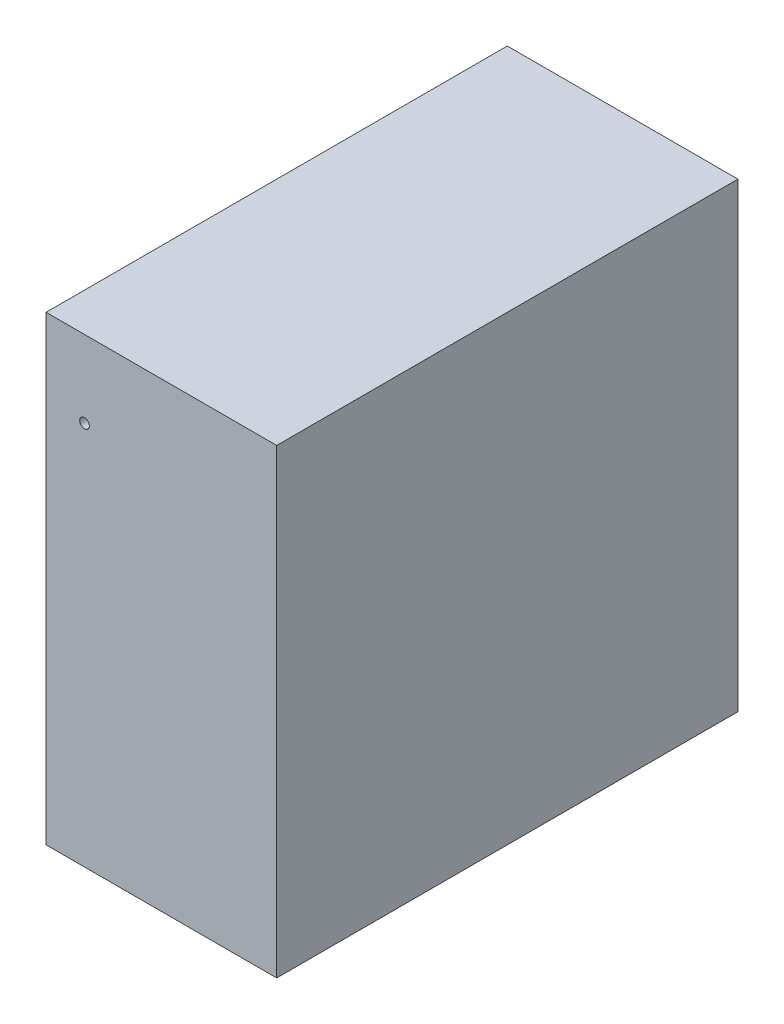
ISO-10303-21;
HEADER;
FILE_DESCRIPTION(('STEP AP214'),'2;1');
FILE_NAME('part.step','',(''),(''),'','','');
FILE_SCHEMA(('AUTOMOTIVE_DESIGN { 1 0 10303 214 1 1 1 1 }'));
ENDSEC;
DATA;
#1=APPLICATION_CONTEXT('core data for automotive mechanical design processes');
#2=APPLICATION_PROTOCOL_DEFINITION('international standard','automotive_design',2000,#1);
#3=PRODUCT_CONTEXT('',#1,'mechanical');
#4=PRODUCT('Part','Part','',(#3));
#5=PRODUCT_RELATED_PRODUCT_CATEGORY('part','',(#4));
#6=PRODUCT_DEFINITION_FORMATION('','',#4);
#7=PRODUCT_DEFINITION_CONTEXT('part definition',#1,'design');
#8=PRODUCT_DEFINITION('design','',#6,#7);
#9=PRODUCT_DEFINITION_SHAPE('','',#8);
#10=(LENGTH_UNIT() NAMED_UNIT(*) SI_UNIT(.MILLI.,.METRE.));
#11=(NAMED_UNIT(*) PLANE_ANGLE_UNIT() SI_UNIT($,.RADIAN.));
#12=(NAMED_UNIT(*) SI_UNIT($,.STERADIAN.) SOLID_ANGLE_UNIT());
#13=UNCERTAINTY_MEASURE_WITH_UNIT(LENGTH_MEASURE(1.E-05),#10,'distance_accuracy_value','');
#14=(GEOMETRIC_REPRESENTATION_CONTEXT(3) GLOBAL_UNCERTAINTY_ASSIGNED_CONTEXT((#13)) GLOBAL_UNIT_ASSIGNED_CONTEXT((#10,
#11,#12)) REPRESENTATION_CONTEXT('',''));
#15=CARTESIAN_POINT('',(0.,0.,0.));
#16=DIRECTION('',(0.,0.,1.));
#17=DIRECTION('',(1.,0.,0.));
#18=AXIS2_PLACEMENT_3D('',#15,#16,#17);
#19=CARTESIAN_POINT('',(0.,0.,304.8));
#20=DIRECTION('',(0.,0.,1.));
#21=DIRECTION('',(1.,0.,0.));
#22=AXIS2_PLACEMENT_3D('',#19,#20,#21);
#23=PLANE('',#22);
#24=DIRECTION('',(0.,1.,0.));
#25=VECTOR('',#24,1.);
#26=CARTESIAN_POINT('',(76.2,152.4,304.8));
#27=LINE('',#26,#25);
#28=CARTESIAN_POINT('',(76.2,-152.4,304.8));
#29=VERTEX_POINT('',#28);
#30=CARTESIAN_POINT('',(76.2,152.4,304.8));
#31=VERTEX_POINT('',#30);
#32=EDGE_CURVE('E85',#29,#31,#27,.T.);
#33=ORIENTED_EDGE('',*,*,#32,.T.);
#34=DIRECTION('',(-1.,0.,0.));
#35=VECTOR('',#34,1.);
#36=CARTESIAN_POINT('',(-76.2,152.4,304.8));
#37=LINE('',#36,#35);
#38=CARTESIAN_POINT('',(-76.2,152.4,304.8));
#39=VERTEX_POINT('',#38);
#40=EDGE_CURVE('E80',#31,#39,#37,.T.);
#41=ORIENTED_EDGE('',*,*,#40,.T.);
#42=DIRECTION('',(0.,-1.,0.));
#43=VECTOR('',#42,1.);
#44=CARTESIAN_POINT('',(-76.2,152.4,304.8));
#45=LINE('',#44,#43);
#46=CARTESIAN_POINT('',(-76.2,-152.4,304.8));
#47=VERTEX_POINT('',#46);
#48=EDGE_CURVE('E83',#39,#47,#45,.T.);
#49=ORIENTED_EDGE('',*,*,#48,.T.);
#50=DIRECTION('',(1.,0.,0.));
#51=VECTOR('',#50,1.);
#52=CARTESIAN_POINT('',(-76.2,-152.4,304.8));
#53=LINE('',#52,#51);
#54=EDGE_CURVE('E50',#47,#29,#53,.T.);
#55=ORIENTED_EDGE('',*,*,#54,.T.);
#56=EDGE_LOOP('',(#33,#41,#49,#55));
#57=FACE_BOUND('',#56,.T.);
#58=CARTESIAN_POINT('',(-50.8,101.6,304.8));
#59=DIRECTION('',(0.,0.,1.));
#60=DIRECTION('',(1.,0.,0.));
#61=AXIS2_PLACEMENT_3D('',#58,#59,#60);
#62=CIRCLE('',#61,3.175);
#63=CARTESIAN_POINT('',(-53.975,101.6,304.8));
#64=VERTEX_POINT('',#63);
#65=EDGE_CURVE('E100',#64,#64,#62,.T.);
#66=ORIENTED_EDGE('',*,*,#65,.F.);
#67=EDGE_LOOP('',(#66));
#68=FACE_BOUND('',#67,.T.);
#69=ADVANCED_FACE('F33',(#57,#68),#23,.T.);
#70=CARTESIAN_POINT('',(0.,0.,0.));
#71=DIRECTION('',(0.,0.,1.));
#72=DIRECTION('',(1.,0.,0.));
#73=AXIS2_PLACEMENT_3D('',#70,#71,#72);
#74=PLANE('',#73);
#75=DIRECTION('',(0.,1.,0.));
#76=VECTOR('',#75,1.);
#77=CARTESIAN_POINT('',(76.2,152.4,0.));
#78=LINE('',#77,#76);
#79=CARTESIAN_POINT('',(76.2,-152.4,0.));
#80=VERTEX_POINT('',#79);
#81=CARTESIAN_POINT('',(76.2,152.4,0.));
#82=VERTEX_POINT('',#81);
#83=EDGE_CURVE('E97',#80,#82,#78,.T.);
#84=ORIENTED_EDGE('',*,*,#83,.F.);
#85=DIRECTION('',(1.,0.,0.));
#86=VECTOR('',#85,1.);
#87=CARTESIAN_POINT('',(-76.2,-152.4,0.));
#88=LINE('',#87,#86);
#89=CARTESIAN_POINT('',(-76.2,-152.4,0.));
#90=VERTEX_POINT('',#89);
#91=EDGE_CURVE('E73',#90,#80,#88,.T.);
#92=ORIENTED_EDGE('',*,*,#91,.F.);
#93=DIRECTION('',(0.,-1.,0.));
#94=VECTOR('',#93,1.);
#95=CARTESIAN_POINT('',(-76.2,152.4,0.));
#96=LINE('',#95,#94);
#97=CARTESIAN_POINT('',(-76.2,152.4,0.));
#98=VERTEX_POINT('',#97);
#99=EDGE_CURVE('E67',#98,#90,#96,.T.);
#100=ORIENTED_EDGE('',*,*,#99,.F.);
#101=DIRECTION('',(-1.,0.,0.));
#102=VECTOR('',#101,1.);
#103=CARTESIAN_POINT('',(-76.2,152.4,0.));
#104=LINE('',#103,#102);
#105=EDGE_CURVE('E89',#82,#98,#104,.T.);
#106=ORIENTED_EDGE('',*,*,#105,.F.);
#107=EDGE_LOOP('',(#84,#92,#100,#106));
#108=FACE_BOUND('',#107,.T.);
#109=CARTESIAN_POINT('',(-50.8,101.6,0.));
#110=DIRECTION('',(0.,0.,1.));
#111=DIRECTION('',(1.,0.,0.));
#112=AXIS2_PLACEMENT_3D('',#109,#110,#111);
#113=CIRCLE('',#112,3.175);
#114=CARTESIAN_POINT('',(-53.975,101.6,0.));
#115=VERTEX_POINT('',#114);
#116=EDGE_CURVE('E112',#115,#115,#113,.T.);
#117=ORIENTED_EDGE('',*,*,#116,.T.);
#118=EDGE_LOOP('',(#117));
#119=FACE_BOUND('',#118,.T.);
#120=ADVANCED_FACE('F108',(#108,#119),#74,.F.);
#121=CARTESIAN_POINT('',(76.2,152.4,304.8));
#122=DIRECTION('',(-1.,0.,0.));
#123=DIRECTION('',(0.,-1.,0.));
#124=AXIS2_PLACEMENT_3D('',#121,#122,#123);
#125=PLANE('',#124);
#126=ORIENTED_EDGE('',*,*,#83,.T.);
#127=DIRECTION('',(0.,0.,-1.));
#128=VECTOR('',#127,1.);
#129=CARTESIAN_POINT('',(76.2,152.4,304.8));
#130=LINE('',#129,#128);
#131=EDGE_CURVE('E11',#31,#82,#130,.T.);
#132=ORIENTED_EDGE('',*,*,#131,.F.);
#133=ORIENTED_EDGE('',*,*,#32,.F.);
#134=DIRECTION('',(0.,0.,-1.));
#135=VECTOR('',#134,1.);
#136=CARTESIAN_POINT('',(76.2,-152.4,304.8));
#137=LINE('',#136,#135);
#138=EDGE_CURVE('E93',#29,#80,#137,.T.);
#139=ORIENTED_EDGE('',*,*,#138,.T.);
#140=EDGE_LOOP('',(#126,#132,#133,#139));
#141=FACE_BOUND('',#140,.T.);
#142=ADVANCED_FACE('F35',(#141),#125,.F.);
#143=CARTESIAN_POINT('',(-76.2,152.4,304.8));
#144=DIRECTION('',(0.,-1.,0.));
#145=DIRECTION('',(0.,0.,-1.));
#146=AXIS2_PLACEMENT_3D('',#143,#144,#145);
#147=PLANE('',#146);
#148=ORIENTED_EDGE('',*,*,#105,.T.);
#149=DIRECTION('',(0.,0.,-1.));
#150=VECTOR('',#149,1.);
#151=CARTESIAN_POINT('',(-76.2,152.4,304.8));
#152=LINE('',#151,#150);
#153=EDGE_CURVE('E42',#39,#98,#152,.T.);
#154=ORIENTED_EDGE('',*,*,#153,.F.);
#155=ORIENTED_EDGE('',*,*,#40,.F.);
#156=ORIENTED_EDGE('',*,*,#131,.T.);
#157=EDGE_LOOP('',(#148,#154,#155,#156));
#158=FACE_BOUND('',#157,.T.);
#159=ADVANCED_FACE('F88',(#158),#147,.F.);
#160=CARTESIAN_POINT('',(-76.2,152.4,304.8));
#161=DIRECTION('',(1.,0.,0.));
#162=DIRECTION('',(0.,1.,0.));
#163=AXIS2_PLACEMENT_3D('',#160,#161,#162);
#164=PLANE('',#163);
#165=ORIENTED_EDGE('',*,*,#99,.T.);
#166=DIRECTION('',(0.,0.,-1.));
#167=VECTOR('',#166,1.);
#168=CARTESIAN_POINT('',(-76.2,-152.4,304.8));
#169=LINE('',#168,#167);
#170=EDGE_CURVE('E90',#47,#90,#169,.T.);
#171=ORIENTED_EDGE('',*,*,#170,.F.);
#172=ORIENTED_EDGE('',*,*,#48,.F.);
#173=ORIENTED_EDGE('',*,*,#153,.T.);
#174=EDGE_LOOP('',(#165,#171,#172,#173));
#175=FACE_BOUND('',#174,.T.);
#176=ADVANCED_FACE('F91',(#175),#164,.F.);
#177=CARTESIAN_POINT('',(-76.2,-152.4,304.8));
#178=DIRECTION('',(0.,1.,0.));
#179=DIRECTION('',(0.,0.,1.));
#180=AXIS2_PLACEMENT_3D('',#177,#178,#179);
#181=PLANE('',#180);
#182=ORIENTED_EDGE('',*,*,#91,.T.);
#183=ORIENTED_EDGE('',*,*,#138,.F.);
#184=ORIENTED_EDGE('',*,*,#54,.F.);
#185=ORIENTED_EDGE('',*,*,#170,.T.);
#186=EDGE_LOOP('',(#182,#183,#184,#185));
#187=FACE_BOUND('',#186,.T.);
#188=ADVANCED_FACE('F105',(#187),#181,.F.);
#189=CARTESIAN_POINT('',(-50.8,101.6,304.8));
#190=DIRECTION('',(0.,0.,-1.));
#191=DIRECTION('',(-1.,0.,0.));
#192=AXIS2_PLACEMENT_3D('',#189,#190,#191);
#193=CYLINDRICAL_SURFACE('',#192,3.175);
#194=CARTESIAN_POINT('',(-53.975,101.6,304.8));
#195=CARTESIAN_POINT('',(-53.975,101.6,301.625));
#196=CARTESIAN_POINT('',(-53.975,101.6,298.45));
#197=CARTESIAN_POINT('',(-53.975,101.6,292.1));
#198=CARTESIAN_POINT('',(-53.975,101.6,288.925));
#199=CARTESIAN_POINT('',(-53.975,101.6,282.575));
#200=CARTESIAN_POINT('',(-53.975,101.6,279.4));
#201=CARTESIAN_POINT('',(-53.975,101.6,273.05));
#202=CARTESIAN_POINT('',(-53.975,101.6,269.875));
#203=CARTESIAN_POINT('',(-53.975,101.6,263.525));
#204=CARTESIAN_POINT('',(-53.975,101.6,260.35));
#205=CARTESIAN_POINT('',(-53.975,101.6,254.));
#206=CARTESIAN_POINT('',(-53.975,101.6,250.825));
#207=CARTESIAN_POINT('',(-53.975,101.6,244.475));
#208=CARTESIAN_POINT('',(-53.975,101.6,241.3));
#209=CARTESIAN_POINT('',(-53.975,101.6,234.95));
#210=CARTESIAN_POINT('',(-53.975,101.6,231.775));
#211=CARTESIAN_POINT('',(-53.975,101.6,225.425));
#212=CARTESIAN_POINT('',(-53.975,101.6,222.25));
#213=CARTESIAN_POINT('',(-53.975,101.6,215.9));
#214=CARTESIAN_POINT('',(-53.975,101.6,212.725));
#215=CARTESIAN_POINT('',(-53.975,101.6,206.375));
#216=CARTESIAN_POINT('',(-53.975,101.6,203.2));
#217=CARTESIAN_POINT('',(-53.975,101.6,196.85));
#218=CARTESIAN_POINT('',(-53.975,101.6,193.675));
#219=CARTESIAN_POINT('',(-53.975,101.6,187.325));
#220=CARTESIAN_POINT('',(-53.975,101.6,184.15));
#221=CARTESIAN_POINT('',(-53.975,101.6,177.8));
#222=CARTESIAN_POINT('',(-53.975,101.6,174.625));
#223=CARTESIAN_POINT('',(-53.975,101.6,168.275));
#224=CARTESIAN_POINT('',(-53.975,101.6,165.1));
#225=CARTESIAN_POINT('',(-53.975,101.6,158.75));
#226=CARTESIAN_POINT('',(-53.975,101.6,155.575));
#227=CARTESIAN_POINT('',(-53.975,101.6,149.225));
#228=CARTESIAN_POINT('',(-53.975,101.6,146.05));
#229=CARTESIAN_POINT('',(-53.975,101.6,139.7));
#230=CARTESIAN_POINT('',(-53.975,101.6,136.525));
#231=CARTESIAN_POINT('',(-53.975,101.6,130.175));
#232=CARTESIAN_POINT('',(-53.975,101.6,127.));
#233=CARTESIAN_POINT('',(-53.975,101.6,120.65));
#234=CARTESIAN_POINT('',(-53.975,101.6,117.475));
#235=CARTESIAN_POINT('',(-53.975,101.6,111.125));
#236=CARTESIAN_POINT('',(-53.975,101.6,107.95));
#237=CARTESIAN_POINT('',(-53.975,101.6,101.6));
#238=CARTESIAN_POINT('',(-53.975,101.6,98.425));
#239=CARTESIAN_POINT('',(-53.975,101.6,92.075));
#240=CARTESIAN_POINT('',(-53.975,101.6,88.9));
#241=CARTESIAN_POINT('',(-53.975,101.6,82.55));
#242=CARTESIAN_POINT('',(-53.975,101.6,79.375));
#243=CARTESIAN_POINT('',(-53.975,101.6,73.025));
#244=CARTESIAN_POINT('',(-53.975,101.6,69.85));
#245=CARTESIAN_POINT('',(-53.975,101.6,63.5));
#246=CARTESIAN_POINT('',(-53.975,101.6,60.325));
#247=CARTESIAN_POINT('',(-53.975,101.6,53.975));
#248=CARTESIAN_POINT('',(-53.975,101.6,50.8));
#249=CARTESIAN_POINT('',(-53.975,101.6,44.45));
#250=CARTESIAN_POINT('',(-53.975,101.6,41.275));
#251=CARTESIAN_POINT('',(-53.975,101.6,34.925));
#252=CARTESIAN_POINT('',(-53.975,101.6,31.75));
#253=CARTESIAN_POINT('',(-53.975,101.6,25.4));
#254=CARTESIAN_POINT('',(-53.975,101.6,22.225));
#255=CARTESIAN_POINT('',(-53.975,101.6,15.875));
#256=CARTESIAN_POINT('',(-53.975,101.6,12.7));
#257=CARTESIAN_POINT('',(-53.975,101.6,6.35));
#258=CARTESIAN_POINT('',(-53.975,101.6,3.175));
#259=CARTESIAN_POINT('',(-53.975,101.6,0.));
#260=B_SPLINE_CURVE_WITH_KNOTS('',3,(#194,#195,#196,#197,#198,#199,#200,#201,#202,#203,#204,
#205,#206,#207,#208,#209,#210,#211,#212,#213,#214,#215,#216,#217,#218,#219,#220,#221,#222,#223,
#224,#225,#226,#227,#228,#229,#230,#231,#232,#233,#234,#235,#236,#237,#238,#239,#240,#241,#242,
#243,#244,#245,#246,#247,#248,#249,#250,#251,#252,#253,#254,#255,#256,#257,#258,#259),
.UNSPECIFIED.,.F.,.F.,(4,2,2,2,2,2,2,2,2,2,2,2,2,2,2,2,2,2,2,2,2,2,2,2,2,2,2,2,2,2,2,2,4),(0.,
9.52499999999995,19.05,28.575,38.1,47.625,57.15,66.675,76.2,85.725,95.2499999999999,104.775,
114.3,123.825,133.35,142.875,152.4,161.925,171.45,180.975,190.5,200.025,209.55,219.075,228.6,
238.125,247.65,257.175,266.7,276.225,285.75,295.275,304.8),.UNSPECIFIED.);
#261=EDGE_CURVE('BSEAM118',#64,#115,#260,.T.);
#262=ORIENTED_EDGE('',*,*,#65,.T.);
#263=ORIENTED_EDGE('',*,*,#116,.F.);
#264=ORIENTED_EDGE('',*,*,#261,.T.);
#265=ORIENTED_EDGE('',*,*,#261,.F.);
#266=EDGE_LOOP('',(#262,#264,#263,#265));
#267=FACE_BOUND('',#266,.T.);
#268=ADVANCED_FACE('F118',(#267),#193,.F.);
#269=CLOSED_SHELL('',(#69,#120,#142,#159,#176,#188,#268));
#270=MANIFOLD_SOLID_BREP('B2',#269);
#271=ADVANCED_BREP_SHAPE_REPRESENTATION('',(#18,#270),#14);
#272=SHAPE_DEFINITION_REPRESENTATION(#9,#271);
ENDSEC;
END-ISO-10303-21;
